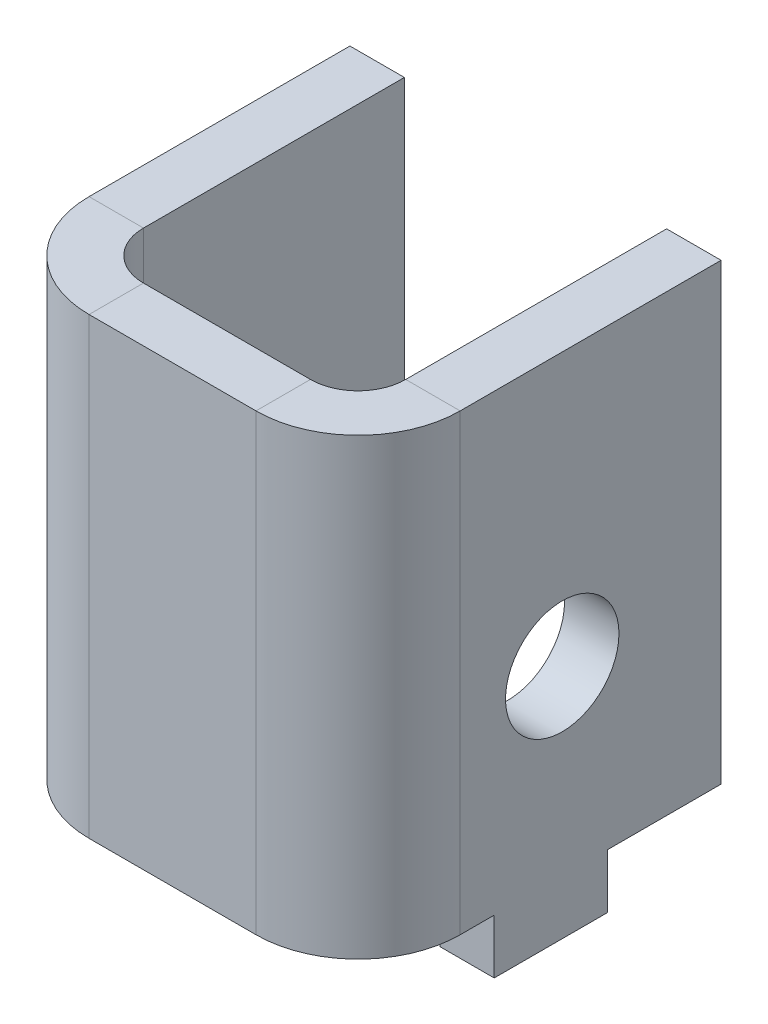
ISO-10303-21;
HEADER;
FILE_DESCRIPTION(('STEP AP214'),'2;1');
FILE_NAME('part.step','',(''),(''),'','','');
FILE_SCHEMA(('AUTOMOTIVE_DESIGN { 1 0 10303 214 1 1 1 1 }'));
ENDSEC;
DATA;
#1=APPLICATION_CONTEXT('core data for automotive mechanical design processes');
#2=APPLICATION_PROTOCOL_DEFINITION('international standard','automotive_design',2000,#1);
#3=PRODUCT_CONTEXT('',#1,'mechanical');
#4=PRODUCT('Part','Part','',(#3));
#5=PRODUCT_RELATED_PRODUCT_CATEGORY('part','',(#4));
#6=PRODUCT_DEFINITION_FORMATION('','',#4);
#7=PRODUCT_DEFINITION_CONTEXT('part definition',#1,'design');
#8=PRODUCT_DEFINITION('design','',#6,#7);
#9=PRODUCT_DEFINITION_SHAPE('','',#8);
#10=(LENGTH_UNIT() NAMED_UNIT(*) SI_UNIT(.MILLI.,.METRE.));
#11=(NAMED_UNIT(*) PLANE_ANGLE_UNIT() SI_UNIT($,.RADIAN.));
#12=(NAMED_UNIT(*) SI_UNIT($,.STERADIAN.) SOLID_ANGLE_UNIT());
#13=UNCERTAINTY_MEASURE_WITH_UNIT(LENGTH_MEASURE(1.E-05),#10,'distance_accuracy_value','');
#14=(GEOMETRIC_REPRESENTATION_CONTEXT(3) GLOBAL_UNCERTAINTY_ASSIGNED_CONTEXT((#13)) GLOBAL_UNIT_ASSIGNED_CONTEXT((#10,
#11,#12)) REPRESENTATION_CONTEXT('',''));
#15=CARTESIAN_POINT('',(0.,0.,0.));
#16=DIRECTION('',(0.,0.,1.));
#17=DIRECTION('',(1.,0.,0.));
#18=AXIS2_PLACEMENT_3D('',#15,#16,#17);
#19=CARTESIAN_POINT('',(447.586099999998,811.2125,14.6050000000001));
#20=DIRECTION('',(0.,-1.,0.));
#21=DIRECTION('',(0.,0.,-1.));
#22=AXIS2_PLACEMENT_3D('',#19,#20,#21);
#23=PLANE('',#22);
#24=DIRECTION('',(0.,0.,1.));
#25=VECTOR('',#24,1.);
#26=CARTESIAN_POINT('',(432.523899999999,811.2125,1.11022302462516E-13));
#27=LINE('',#26,#25);
#28=CARTESIAN_POINT('',(432.523899999999,811.2125,12.7000000000001));
#29=VERTEX_POINT('',#28);
#30=CARTESIAN_POINT('',(432.523899999999,811.2125,14.6050000000001));
#31=VERTEX_POINT('',#30);
#32=EDGE_CURVE('E59',#29,#31,#27,.T.);
#33=ORIENTED_EDGE('',*,*,#32,.F.);
#34=DIRECTION('',(-1.,0.,0.));
#35=VECTOR('',#34,1.);
#36=CARTESIAN_POINT('',(435.571899999999,811.2125,12.7000000000001));
#37=LINE('',#36,#35);
#38=CARTESIAN_POINT('',(435.571899999999,811.2125,12.7000000000001));
#39=VERTEX_POINT('',#38);
#40=EDGE_CURVE('E197',#39,#29,#37,.T.);
#41=ORIENTED_EDGE('',*,*,#40,.F.);
#42=DIRECTION('',(0.,0.,1.));
#43=VECTOR('',#42,1.);
#44=CARTESIAN_POINT('',(435.571899999999,811.2125,1.11022302462516E-13));
#45=LINE('',#44,#43);
#46=CARTESIAN_POINT('',(435.571899999999,811.2125,14.6050000000001));
#47=VERTEX_POINT('',#46);
#48=EDGE_CURVE('E182',#39,#47,#45,.T.);
#49=ORIENTED_EDGE('',*,*,#48,.T.);
#50=DIRECTION('',(-1.,0.,0.));
#51=VECTOR('',#50,1.);
#52=CARTESIAN_POINT('',(435.571899999999,811.2125,14.6050000000001));
#53=LINE('',#52,#51);
#54=EDGE_CURVE('E52',#47,#31,#53,.T.);
#55=ORIENTED_EDGE('',*,*,#54,.T.);
#56=EDGE_LOOP('',(#33,#41,#49,#55));
#57=FACE_BOUND('',#56,.T.);
#58=ADVANCED_FACE('F43',(#57),#23,.T.);
#59=CARTESIAN_POINT('',(435.571899999999,811.2125,1.11022302462516E-13));
#60=VERTEX_POINT('',#59);
#61=CARTESIAN_POINT('',(435.571899999999,811.2125,6.35000000000011));
#62=VERTEX_POINT('',#61);
#63=EDGE_CURVE('E193',#60,#62,#45,.T.);
#64=ORIENTED_EDGE('',*,*,#63,.T.);
#65=DIRECTION('',(1.,0.,0.));
#66=VECTOR('',#65,1.);
#67=CARTESIAN_POINT('',(435.571899999999,811.2125,6.35000000000011));
#68=LINE('',#67,#66);
#69=CARTESIAN_POINT('',(432.523899999999,811.2125,6.35000000000011));
#70=VERTEX_POINT('',#69);
#71=EDGE_CURVE('E67',#70,#62,#68,.T.);
#72=ORIENTED_EDGE('',*,*,#71,.F.);
#73=CARTESIAN_POINT('',(432.523899999999,811.2125,1.11022302462516E-13));
#74=VERTEX_POINT('',#73);
#75=EDGE_CURVE('E272',#74,#70,#27,.T.);
#76=ORIENTED_EDGE('',*,*,#75,.F.);
#77=DIRECTION('',(-1.,0.,0.));
#78=VECTOR('',#77,1.);
#79=CARTESIAN_POINT('',(435.571899999999,811.2125,1.11022302462516E-13));
#80=LINE('',#79,#78);
#81=EDGE_CURVE('E194',#60,#74,#80,.T.);
#82=ORIENTED_EDGE('',*,*,#81,.F.);
#83=EDGE_LOOP('',(#64,#72,#76,#82));
#84=FACE_BOUND('',#83,.T.);
#85=ADVANCED_FACE('F453',(#84),#23,.T.);
#86=CARTESIAN_POINT('',(447.586099999998,811.2125,17.2720000000001));
#87=DIRECTION('',(0.,-1.,0.));
#88=DIRECTION('',(0.,0.,-1.));
#89=AXIS2_PLACEMENT_3D('',#86,#87,#88);
#90=PLANE('',#89);
#91=DIRECTION('',(0.,0.,-1.));
#92=VECTOR('',#91,1.);
#93=CARTESIAN_POINT('',(453.301099999998,811.2125,20.3200000000001));
#94=LINE('',#93,#92);
#95=CARTESIAN_POINT('',(453.301099999998,811.2125,6.35000000000011));
#96=VERTEX_POINT('',#95);
#97=CARTESIAN_POINT('',(453.301099999998,811.2125,1.11022302462516E-13));
#98=VERTEX_POINT('',#97);
#99=EDGE_CURVE('E259',#96,#98,#94,.T.);
#100=ORIENTED_EDGE('',*,*,#99,.F.);
#101=DIRECTION('',(1.,0.,0.));
#102=VECTOR('',#101,1.);
#103=CARTESIAN_POINT('',(450.253099999998,811.2125,6.35000000000011));
#104=LINE('',#103,#102);
#105=CARTESIAN_POINT('',(450.253099999998,811.2125,6.35000000000011));
#106=VERTEX_POINT('',#105);
#107=EDGE_CURVE('E200',#106,#96,#104,.T.);
#108=ORIENTED_EDGE('',*,*,#107,.F.);
#109=DIRECTION('',(0.,0.,-1.));
#110=VECTOR('',#109,1.);
#111=CARTESIAN_POINT('',(450.253099999998,811.2125,20.3200000000001));
#112=LINE('',#111,#110);
#113=CARTESIAN_POINT('',(450.253099999998,811.2125,1.11022302462516E-13));
#114=VERTEX_POINT('',#113);
#115=EDGE_CURVE('E256',#106,#114,#112,.T.);
#116=ORIENTED_EDGE('',*,*,#115,.T.);
#117=DIRECTION('',(-1.,0.,0.));
#118=VECTOR('',#117,1.);
#119=CARTESIAN_POINT('',(453.301099999998,811.2125,1.11022302462516E-13));
#120=LINE('',#119,#118);
#121=EDGE_CURVE('E255',#98,#114,#120,.T.);
#122=ORIENTED_EDGE('',*,*,#121,.F.);
#123=EDGE_LOOP('',(#100,#108,#116,#122));
#124=FACE_BOUND('',#123,.T.);
#125=ADVANCED_FACE('F418',(#124),#90,.T.);
#126=CARTESIAN_POINT('',(450.253099999998,811.2125,14.6050000000001));
#127=VERTEX_POINT('',#126);
#128=CARTESIAN_POINT('',(450.253099999998,811.2125,12.7000000000001));
#129=VERTEX_POINT('',#128);
#130=EDGE_CURVE('E252',#127,#129,#112,.T.);
#131=ORIENTED_EDGE('',*,*,#130,.T.);
#132=DIRECTION('',(-1.,0.,0.));
#133=VECTOR('',#132,1.);
#134=CARTESIAN_POINT('',(450.253099999998,811.2125,12.7000000000001));
#135=LINE('',#134,#133);
#136=CARTESIAN_POINT('',(453.301099999998,811.2125,12.7000000000001));
#137=VERTEX_POINT('',#136);
#138=EDGE_CURVE('E224',#137,#129,#135,.T.);
#139=ORIENTED_EDGE('',*,*,#138,.F.);
#140=CARTESIAN_POINT('',(453.301099999998,811.2125,14.6050000000001));
#141=VERTEX_POINT('',#140);
#142=EDGE_CURVE('E260',#141,#137,#94,.T.);
#143=ORIENTED_EDGE('',*,*,#142,.F.);
#144=DIRECTION('',(-1.,0.,0.));
#145=VECTOR('',#144,1.);
#146=CARTESIAN_POINT('',(453.301099999998,811.2125,14.6050000000001));
#147=LINE('',#146,#145);
#148=EDGE_CURVE('E355',#141,#127,#147,.T.);
#149=ORIENTED_EDGE('',*,*,#148,.T.);
#150=EDGE_LOOP('',(#131,#139,#143,#149));
#151=FACE_BOUND('',#150,.T.);
#152=ADVANCED_FACE('F396',(#151),#90,.T.);
#153=CARTESIAN_POINT('',(438.238899999999,811.2125,20.3200000000001));
#154=DIRECTION('',(0.,-1.,0.));
#155=DIRECTION('',(0.,0.,-1.));
#156=AXIS2_PLACEMENT_3D('',#153,#154,#155);
#157=PLANE('',#156);
#158=DIRECTION('',(0.,0.,-1.));
#159=VECTOR('',#158,1.);
#160=CARTESIAN_POINT('',(438.238899999999,811.2125,20.3200000000001));
#161=LINE('',#160,#159);
#162=CARTESIAN_POINT('',(438.238899999999,811.2125,20.3200000000001));
#163=VERTEX_POINT('',#162);
#164=CARTESIAN_POINT('',(438.238899999999,811.2125,17.2720000000001));
#165=VERTEX_POINT('',#164);
#166=EDGE_CURVE('E11',#163,#165,#161,.T.);
#167=ORIENTED_EDGE('',*,*,#166,.F.);
#168=CARTESIAN_POINT('',(438.238899999999,811.2125,14.6050000000001));
#169=DIRECTION('',(0.,-1.,0.));
#170=DIRECTION('',(0.,0.,-1.));
#171=AXIS2_PLACEMENT_3D('',#168,#169,#170);
#172=CIRCLE('',#171,5.715);
#173=EDGE_CURVE('E269',#31,#163,#172,.F.);
#174=ORIENTED_EDGE('',*,*,#173,.F.);
#175=ORIENTED_EDGE('',*,*,#54,.F.);
#176=CARTESIAN_POINT('',(438.238899999999,811.2125,14.6050000000001));
#177=DIRECTION('',(0.,-1.,0.));
#178=DIRECTION('',(1.,0.,0.));
#179=AXIS2_PLACEMENT_3D('',#176,#177,#178);
#180=CIRCLE('',#179,2.667);
#181=EDGE_CURVE('E276',#47,#165,#180,.F.);
#182=ORIENTED_EDGE('',*,*,#181,.T.);
#183=EDGE_LOOP('',(#167,#174,#175,#182));
#184=FACE_BOUND('',#183,.T.);
#185=ADVANCED_FACE('F45',(#184),#157,.T.);
#186=CARTESIAN_POINT('',(435.571899999999,811.2125,14.6050000000001));
#187=DIRECTION('',(0.,-1.,0.));
#188=DIRECTION('',(0.,0.,-1.));
#189=AXIS2_PLACEMENT_3D('',#186,#187,#188);
#190=PLANE('',#189);
#191=DIRECTION('',(1.,0.,0.));
#192=VECTOR('',#191,1.);
#193=CARTESIAN_POINT('',(432.523899999999,811.2125,20.3200000000001));
#194=LINE('',#193,#192);
#195=CARTESIAN_POINT('',(447.586099999998,811.2125,20.3200000000001));
#196=VERTEX_POINT('',#195);
#197=EDGE_CURVE('E266',#163,#196,#194,.T.);
#198=ORIENTED_EDGE('',*,*,#197,.F.);
#199=ORIENTED_EDGE('',*,*,#166,.T.);
#200=DIRECTION('',(1.,0.,0.));
#201=VECTOR('',#200,1.);
#202=CARTESIAN_POINT('',(432.523899999999,811.2125,17.2720000000001));
#203=LINE('',#202,#201);
#204=CARTESIAN_POINT('',(447.586099999998,811.2125,17.2720000000001));
#205=VERTEX_POINT('',#204);
#206=EDGE_CURVE('E279',#165,#205,#203,.T.);
#207=ORIENTED_EDGE('',*,*,#206,.T.);
#208=DIRECTION('',(0.,0.,1.));
#209=VECTOR('',#208,1.);
#210=CARTESIAN_POINT('',(447.586099999998,811.2125,17.2720000000001));
#211=LINE('',#210,#209);
#212=EDGE_CURVE('E353',#205,#196,#211,.T.);
#213=ORIENTED_EDGE('',*,*,#212,.T.);
#214=EDGE_LOOP('',(#198,#199,#207,#213));
#215=FACE_BOUND('',#214,.T.);
#216=ADVANCED_FACE('F376',(#215),#190,.T.);
#217=CARTESIAN_POINT('',(432.523899999999,836.6125,14.6050000000001));
#218=DIRECTION('',(0.,1.,0.));
#219=DIRECTION('',(0.,0.,1.));
#220=AXIS2_PLACEMENT_3D('',#217,#218,#219);
#221=PLANE('',#220);
#222=DIRECTION('',(1.,0.,0.));
#223=VECTOR('',#222,1.);
#224=CARTESIAN_POINT('',(432.523899999999,836.6125,14.6050000000001));
#225=LINE('',#224,#223);
#226=CARTESIAN_POINT('',(432.523899999999,836.6125,14.6050000000001));
#227=VERTEX_POINT('',#226);
#228=CARTESIAN_POINT('',(435.571899999999,836.6125,14.6050000000001));
#229=VERTEX_POINT('',#228);
#230=EDGE_CURVE('E359',#227,#229,#225,.T.);
#231=ORIENTED_EDGE('',*,*,#230,.F.);
#232=CARTESIAN_POINT('',(438.238899999999,836.6125,14.6050000000001));
#233=DIRECTION('',(0.,-1.,0.));
#234=DIRECTION('',(0.,0.,-1.));
#235=AXIS2_PLACEMENT_3D('',#232,#233,#234);
#236=CIRCLE('',#235,5.715);
#237=CARTESIAN_POINT('',(438.238899999999,836.6125,20.3200000000001));
#238=VERTEX_POINT('',#237);
#239=EDGE_CURVE('E300',#227,#238,#236,.F.);
#240=ORIENTED_EDGE('',*,*,#239,.T.);
#241=DIRECTION('',(0.,0.,1.));
#242=VECTOR('',#241,1.);
#243=CARTESIAN_POINT('',(438.238899999999,836.6125,17.2720000000001));
#244=LINE('',#243,#242);
#245=CARTESIAN_POINT('',(438.238899999999,836.6125,17.2720000000001));
#246=VERTEX_POINT('',#245);
#247=EDGE_CURVE('E357',#246,#238,#244,.T.);
#248=ORIENTED_EDGE('',*,*,#247,.F.);
#249=CARTESIAN_POINT('',(438.238899999999,836.6125,14.6050000000001));
#250=DIRECTION('',(0.,-1.,0.));
#251=DIRECTION('',(1.,0.,0.));
#252=AXIS2_PLACEMENT_3D('',#249,#250,#251);
#253=CIRCLE('',#252,2.667);
#254=EDGE_CURVE('E311',#229,#246,#253,.F.);
#255=ORIENTED_EDGE('',*,*,#254,.F.);
#256=EDGE_LOOP('',(#231,#240,#248,#255));
#257=FACE_BOUND('',#256,.T.);
#258=ADVANCED_FACE('F438',(#257),#221,.T.);
#259=CARTESIAN_POINT('',(438.238899999999,836.6125,17.2720000000001));
#260=DIRECTION('',(0.,1.,0.));
#261=DIRECTION('',(0.,0.,1.));
#262=AXIS2_PLACEMENT_3D('',#259,#260,#261);
#263=PLANE('',#262);
#264=DIRECTION('',(0.,0.,1.));
#265=VECTOR('',#264,1.);
#266=CARTESIAN_POINT('',(432.523899999999,836.6125,1.11022302462516E-13));
#267=LINE('',#266,#265);
#268=CARTESIAN_POINT('',(432.523899999999,836.6125,1.11022302462516E-13));
#269=VERTEX_POINT('',#268);
#270=EDGE_CURVE('E303',#269,#227,#267,.T.);
#271=ORIENTED_EDGE('',*,*,#270,.T.);
#272=ORIENTED_EDGE('',*,*,#230,.T.);
#273=DIRECTION('',(0.,0.,1.));
#274=VECTOR('',#273,1.);
#275=CARTESIAN_POINT('',(435.571899999999,836.6125,1.11022302462516E-13));
#276=LINE('',#275,#274);
#277=CARTESIAN_POINT('',(435.571899999999,836.6125,1.11022302462516E-13));
#278=VERTEX_POINT('',#277);
#279=EDGE_CURVE('E309',#278,#229,#276,.T.);
#280=ORIENTED_EDGE('',*,*,#279,.F.);
#281=DIRECTION('',(-1.,0.,0.));
#282=VECTOR('',#281,1.);
#283=CARTESIAN_POINT('',(435.571899999999,836.6125,1.11022302462516E-13));
#284=LINE('',#283,#282);
#285=EDGE_CURVE('E306',#278,#269,#284,.T.);
#286=ORIENTED_EDGE('',*,*,#285,.T.);
#287=EDGE_LOOP('',(#271,#272,#280,#286));
#288=FACE_BOUND('',#287,.T.);
#289=ADVANCED_FACE('F630',(#288),#263,.T.);
#290=CARTESIAN_POINT('',(453.301099999998,811.2125,14.6050000000001));
#291=DIRECTION('',(0.,-1.,0.));
#292=DIRECTION('',(0.,0.,-1.));
#293=AXIS2_PLACEMENT_3D('',#290,#291,#292);
#294=PLANE('',#293);
#295=ORIENTED_EDGE('',*,*,#148,.F.);
#296=CARTESIAN_POINT('',(447.586099999998,811.2125,14.6050000000001));
#297=DIRECTION('',(0.,-1.,0.));
#298=DIRECTION('',(0.,0.,-1.));
#299=AXIS2_PLACEMENT_3D('',#296,#297,#298);
#300=CIRCLE('',#299,5.715);
#301=EDGE_CURVE('E263',#196,#141,#300,.F.);
#302=ORIENTED_EDGE('',*,*,#301,.F.);
#303=ORIENTED_EDGE('',*,*,#212,.F.);
#304=CARTESIAN_POINT('',(447.586099999998,811.2125,14.6050000000001));
#305=DIRECTION('',(0.,-1.,0.));
#306=DIRECTION('',(1.,0.,0.));
#307=AXIS2_PLACEMENT_3D('',#304,#305,#306);
#308=CIRCLE('',#307,2.667);
#309=EDGE_CURVE('E282',#205,#127,#308,.F.);
#310=ORIENTED_EDGE('',*,*,#309,.T.);
#311=EDGE_LOOP('',(#295,#302,#303,#310));
#312=FACE_BOUND('',#311,.T.);
#313=ADVANCED_FACE('F385',(#312),#294,.T.);
#314=CARTESIAN_POINT('',(447.586099999998,836.6125,20.3200000000001));
#315=DIRECTION('',(0.,1.,0.));
#316=DIRECTION('',(0.,0.,1.));
#317=AXIS2_PLACEMENT_3D('',#314,#315,#316);
#318=PLANE('',#317);
#319=DIRECTION('',(0.,0.,-1.));
#320=VECTOR('',#319,1.);
#321=CARTESIAN_POINT('',(447.586099999998,836.6125,20.3200000000001));
#322=LINE('',#321,#320);
#323=CARTESIAN_POINT('',(447.586099999998,836.6125,20.3200000000001));
#324=VERTEX_POINT('',#323);
#325=CARTESIAN_POINT('',(447.586099999998,836.6125,17.2720000000001));
#326=VERTEX_POINT('',#325);
#327=EDGE_CURVE('E351',#324,#326,#322,.T.);
#328=ORIENTED_EDGE('',*,*,#327,.F.);
#329=CARTESIAN_POINT('',(447.586099999998,836.6125,14.6050000000001));
#330=DIRECTION('',(0.,-1.,0.));
#331=DIRECTION('',(0.,0.,-1.));
#332=AXIS2_PLACEMENT_3D('',#329,#330,#331);
#333=CIRCLE('',#332,5.715);
#334=CARTESIAN_POINT('',(453.301099999998,836.6125,14.6050000000001));
#335=VERTEX_POINT('',#334);
#336=EDGE_CURVE('E294',#324,#335,#333,.F.);
#337=ORIENTED_EDGE('',*,*,#336,.T.);
#338=DIRECTION('',(1.,0.,0.));
#339=VECTOR('',#338,1.);
#340=CARTESIAN_POINT('',(450.253099999998,836.6125,14.6050000000001));
#341=LINE('',#340,#339);
#342=CARTESIAN_POINT('',(450.253099999998,836.6125,14.6050000000001));
#343=VERTEX_POINT('',#342);
#344=EDGE_CURVE('E349',#343,#335,#341,.T.);
#345=ORIENTED_EDGE('',*,*,#344,.F.);
#346=CARTESIAN_POINT('',(447.586099999998,836.6125,14.6050000000001));
#347=DIRECTION('',(0.,-1.,0.));
#348=DIRECTION('',(1.,0.,0.));
#349=AXIS2_PLACEMENT_3D('',#346,#347,#348);
#350=CIRCLE('',#349,2.667);
#351=EDGE_CURVE('E317',#326,#343,#350,.F.);
#352=ORIENTED_EDGE('',*,*,#351,.F.);
#353=EDGE_LOOP('',(#328,#337,#345,#352));
#354=FACE_BOUND('',#353,.T.);
#355=ADVANCED_FACE('F428',(#354),#318,.T.);
#356=CARTESIAN_POINT('',(450.253099999998,836.6125,14.6050000000001));
#357=DIRECTION('',(0.,1.,0.));
#358=DIRECTION('',(0.,0.,1.));
#359=AXIS2_PLACEMENT_3D('',#356,#357,#358);
#360=PLANE('',#359);
#361=DIRECTION('',(1.,0.,0.));
#362=VECTOR('',#361,1.);
#363=CARTESIAN_POINT('',(432.523899999999,836.6125,20.3200000000001));
#364=LINE('',#363,#362);
#365=EDGE_CURVE('E297',#238,#324,#364,.T.);
#366=ORIENTED_EDGE('',*,*,#365,.T.);
#367=ORIENTED_EDGE('',*,*,#327,.T.);
#368=DIRECTION('',(1.,0.,0.));
#369=VECTOR('',#368,1.);
#370=CARTESIAN_POINT('',(432.523899999999,836.6125,17.2720000000001));
#371=LINE('',#370,#369);
#372=EDGE_CURVE('E314',#246,#326,#371,.T.);
#373=ORIENTED_EDGE('',*,*,#372,.F.);
#374=ORIENTED_EDGE('',*,*,#247,.T.);
#375=EDGE_LOOP('',(#366,#367,#373,#374));
#376=FACE_BOUND('',#375,.T.);
#377=ADVANCED_FACE('F435',(#376),#360,.T.);
#378=CARTESIAN_POINT('',(450.253099999998,811.2125,20.3200000000001));
#379=DIRECTION('',(1.,0.,0.));
#380=DIRECTION('',(0.,1.,0.));
#381=AXIS2_PLACEMENT_3D('',#378,#379,#380);
#382=PLANE('',#381);
#383=CARTESIAN_POINT('',(450.253099999998,821.3725,8.89000000000131));
#384=DIRECTION('',(1.,0.,0.));
#385=DIRECTION('',(0.,1.,0.));
#386=AXIS2_PLACEMENT_3D('',#383,#384,#385);
#387=CIRCLE('',#386,3.175);
#388=CARTESIAN_POINT('',(450.253099999998,824.5475,8.89000000000131));
#389=VERTEX_POINT('',#388);
#390=EDGE_CURVE('E248',#389,#389,#387,.T.);
#391=ORIENTED_EDGE('',*,*,#390,.T.);
#392=EDGE_LOOP('',(#391));
#393=FACE_BOUND('',#392,.T.);
#394=DIRECTION('',(0.,0.,-1.));
#395=VECTOR('',#394,1.);
#396=CARTESIAN_POINT('',(450.253099999998,836.6125,20.3200000000001));
#397=LINE('',#396,#395);
#398=CARTESIAN_POINT('',(450.253099999998,836.6125,1.11022302462516E-13));
#399=VERTEX_POINT('',#398);
#400=EDGE_CURVE('E251',#343,#399,#397,.T.);
#401=ORIENTED_EDGE('',*,*,#400,.T.);
#402=DIRECTION('',(0.,1.,0.));
#403=VECTOR('',#402,1.);
#404=CARTESIAN_POINT('',(450.253099999998,811.2125,1.11022302462516E-13));
#405=LINE('',#404,#403);
#406=EDGE_CURVE('E347',#114,#399,#405,.T.);
#407=ORIENTED_EDGE('',*,*,#406,.F.);
#408=ORIENTED_EDGE('',*,*,#115,.F.);
#409=DIRECTION('',(0.,1.,0.));
#410=VECTOR('',#409,1.);
#411=CARTESIAN_POINT('',(450.253099999998,808.1645,6.35000000000011));
#412=LINE('',#411,#410);
#413=CARTESIAN_POINT('',(450.253099999998,808.1645,6.35000000000011));
#414=VERTEX_POINT('',#413);
#415=EDGE_CURVE('E240',#414,#106,#412,.T.);
#416=ORIENTED_EDGE('',*,*,#415,.F.);
#417=DIRECTION('',(0.,0.,-1.));
#418=VECTOR('',#417,1.);
#419=CARTESIAN_POINT('',(450.253099999998,808.1645,12.7000000000001));
#420=LINE('',#419,#418);
#421=CARTESIAN_POINT('',(450.253099999998,808.1645,12.7000000000001));
#422=VERTEX_POINT('',#421);
#423=EDGE_CURVE('E220',#422,#414,#420,.T.);
#424=ORIENTED_EDGE('',*,*,#423,.F.);
#425=DIRECTION('',(0.,1.,0.));
#426=VECTOR('',#425,1.);
#427=CARTESIAN_POINT('',(450.253099999998,808.1645,12.7000000000001));
#428=LINE('',#427,#426);
#429=EDGE_CURVE('E230',#422,#129,#428,.T.);
#430=ORIENTED_EDGE('',*,*,#429,.T.);
#431=ORIENTED_EDGE('',*,*,#130,.F.);
#432=DIRECTION('',(0.,1.,0.));
#433=VECTOR('',#432,1.);
#434=CARTESIAN_POINT('',(450.253099999998,811.2125,14.6050000000001));
#435=LINE('',#434,#433);
#436=EDGE_CURVE('E285',#127,#343,#435,.T.);
#437=ORIENTED_EDGE('',*,*,#436,.T.);
#438=EDGE_LOOP('',(#401,#407,#408,#416,#424,#430,#431,#437));
#439=FACE_BOUND('',#438,.T.);
#440=ADVANCED_FACE('F404',(#393,#439),#382,.F.);
#441=CARTESIAN_POINT('',(453.301099999998,811.2125,1.11022302462516E-13));
#442=DIRECTION('',(0.,0.,-1.));
#443=DIRECTION('',(0.,1.,0.));
#444=AXIS2_PLACEMENT_3D('',#441,#442,#443);
#445=PLANE('',#444);
#446=DIRECTION('',(-1.,0.,0.));
#447=VECTOR('',#446,1.);
#448=CARTESIAN_POINT('',(453.301099999998,836.6125,1.11022302462516E-13));
#449=LINE('',#448,#447);
#450=CARTESIAN_POINT('',(453.301099999998,836.6125,1.11022302462516E-13));
#451=VERTEX_POINT('',#450);
#452=EDGE_CURVE('E288',#451,#399,#449,.T.);
#453=ORIENTED_EDGE('',*,*,#452,.F.);
#454=DIRECTION('',(0.,1.,0.));
#455=VECTOR('',#454,1.);
#456=CARTESIAN_POINT('',(453.301099999998,811.2125,1.11022302462516E-13));
#457=LINE('',#456,#455);
#458=EDGE_CURVE('E345',#98,#451,#457,.T.);
#459=ORIENTED_EDGE('',*,*,#458,.F.);
#460=ORIENTED_EDGE('',*,*,#121,.T.);
#461=ORIENTED_EDGE('',*,*,#406,.T.);
#462=EDGE_LOOP('',(#453,#459,#460,#461));
#463=FACE_BOUND('',#462,.T.);
#464=ADVANCED_FACE('F422',(#463),#445,.T.);
#465=CARTESIAN_POINT('',(453.301099999998,811.2125,20.3200000000001));
#466=DIRECTION('',(1.,0.,0.));
#467=DIRECTION('',(0.,1.,0.));
#468=AXIS2_PLACEMENT_3D('',#465,#466,#467);
#469=PLANE('',#468);
#470=CARTESIAN_POINT('',(453.301099999998,821.3725,8.89000000000135));
#471=DIRECTION('',(1.,0.,0.));
#472=DIRECTION('',(0.,0.,-1.));
#473=AXIS2_PLACEMENT_3D('',#470,#471,#472);
#474=CIRCLE('',#473,3.175);
#475=CARTESIAN_POINT('',(453.301099999998,821.3725,5.71500000000135));
#476=VERTEX_POINT('',#475);
#477=EDGE_CURVE('E242',#476,#476,#474,.T.);
#478=ORIENTED_EDGE('',*,*,#477,.F.);
#479=EDGE_LOOP('',(#478));
#480=FACE_BOUND('',#479,.T.);
#481=DIRECTION('',(0.,0.,-1.));
#482=VECTOR('',#481,1.);
#483=CARTESIAN_POINT('',(453.301099999998,836.6125,20.3200000000001));
#484=LINE('',#483,#482);
#485=EDGE_CURVE('E291',#335,#451,#484,.T.);
#486=ORIENTED_EDGE('',*,*,#485,.F.);
#487=DIRECTION('',(0.,1.,0.));
#488=VECTOR('',#487,1.);
#489=CARTESIAN_POINT('',(453.301099999998,811.2125,14.6050000000001));
#490=LINE('',#489,#488);
#491=EDGE_CURVE('E342',#141,#335,#490,.T.);
#492=ORIENTED_EDGE('',*,*,#491,.F.);
#493=ORIENTED_EDGE('',*,*,#142,.T.);
#494=DIRECTION('',(0.,1.,0.));
#495=VECTOR('',#494,1.);
#496=CARTESIAN_POINT('',(453.301099999998,808.1645,12.7000000000001));
#497=LINE('',#496,#495);
#498=CARTESIAN_POINT('',(453.301099999998,808.1645,12.7000000000001));
#499=VERTEX_POINT('',#498);
#500=EDGE_CURVE('E236',#499,#137,#497,.T.);
#501=ORIENTED_EDGE('',*,*,#500,.F.);
#502=DIRECTION('',(0.,0.,1.));
#503=VECTOR('',#502,1.);
#504=CARTESIAN_POINT('',(453.301099999998,808.1645,12.7000000000001));
#505=LINE('',#504,#503);
#506=CARTESIAN_POINT('',(453.301099999998,808.1645,6.35000000000011));
#507=VERTEX_POINT('',#506);
#508=EDGE_CURVE('E226',#507,#499,#505,.T.);
#509=ORIENTED_EDGE('',*,*,#508,.F.);
#510=DIRECTION('',(0.,1.,0.));
#511=VECTOR('',#510,1.);
#512=CARTESIAN_POINT('',(453.301099999998,808.1645,6.35000000000011));
#513=LINE('',#512,#511);
#514=EDGE_CURVE('E238',#507,#96,#513,.T.);
#515=ORIENTED_EDGE('',*,*,#514,.T.);
#516=ORIENTED_EDGE('',*,*,#99,.T.);
#517=ORIENTED_EDGE('',*,*,#458,.T.);
#518=EDGE_LOOP('',(#486,#492,#493,#501,#509,#515,#516,#517));
#519=FACE_BOUND('',#518,.T.);
#520=ADVANCED_FACE('F393',(#480,#519),#469,.T.);
#521=CARTESIAN_POINT('',(447.586099999998,811.2125,14.6050000000001));
#522=DIRECTION('',(0.,1.,0.));
#523=DIRECTION('',(0.,0.,1.));
#524=AXIS2_PLACEMENT_3D('',#521,#522,#523);
#525=CYLINDRICAL_SURFACE('',#524,5.715);
#526=ORIENTED_EDGE('',*,*,#336,.F.);
#527=DIRECTION('',(0.,1.,0.));
#528=VECTOR('',#527,1.);
#529=CARTESIAN_POINT('',(447.586099999998,811.2125,20.3200000000001));
#530=LINE('',#529,#528);
#531=EDGE_CURVE('E339',#196,#324,#530,.T.);
#532=ORIENTED_EDGE('',*,*,#531,.F.);
#533=ORIENTED_EDGE('',*,*,#301,.T.);
#534=ORIENTED_EDGE('',*,*,#491,.T.);
#535=EDGE_LOOP('',(#526,#532,#533,#534));
#536=FACE_BOUND('',#535,.T.);
#537=ADVANCED_FACE('F384',(#536),#525,.T.);
#538=CARTESIAN_POINT('',(432.523899999999,811.2125,20.3200000000001));
#539=DIRECTION('',(0.,0.,1.));
#540=DIRECTION('',(0.,-1.,0.));
#541=AXIS2_PLACEMENT_3D('',#538,#539,#540);
#542=PLANE('',#541);
#543=ORIENTED_EDGE('',*,*,#365,.F.);
#544=DIRECTION('',(0.,1.,0.));
#545=VECTOR('',#544,1.);
#546=CARTESIAN_POINT('',(438.238899999999,811.2125,20.3200000000001));
#547=LINE('',#546,#545);
#548=EDGE_CURVE('E336',#163,#238,#547,.T.);
#549=ORIENTED_EDGE('',*,*,#548,.F.);
#550=ORIENTED_EDGE('',*,*,#197,.T.);
#551=ORIENTED_EDGE('',*,*,#531,.T.);
#552=EDGE_LOOP('',(#543,#549,#550,#551));
#553=FACE_BOUND('',#552,.T.);
#554=ADVANCED_FACE('F375',(#553),#542,.T.);
#555=CARTESIAN_POINT('',(438.238899999999,811.2125,14.6050000000001));
#556=DIRECTION('',(0.,1.,0.));
#557=DIRECTION('',(0.,0.,1.));
#558=AXIS2_PLACEMENT_3D('',#555,#556,#557);
#559=CYLINDRICAL_SURFACE('',#558,5.715);
#560=ORIENTED_EDGE('',*,*,#239,.F.);
#561=DIRECTION('',(0.,1.,0.));
#562=VECTOR('',#561,1.);
#563=CARTESIAN_POINT('',(432.523899999999,811.2125,14.6050000000001));
#564=LINE('',#563,#562);
#565=EDGE_CURVE('E333',#31,#227,#564,.T.);
#566=ORIENTED_EDGE('',*,*,#565,.F.);
#567=ORIENTED_EDGE('',*,*,#173,.T.);
#568=ORIENTED_EDGE('',*,*,#548,.T.);
#569=EDGE_LOOP('',(#560,#566,#567,#568));
#570=FACE_BOUND('',#569,.T.);
#571=ADVANCED_FACE('F366',(#570),#559,.T.);
#572=CARTESIAN_POINT('',(432.523899999999,811.2125,1.11022302462516E-13));
#573=DIRECTION('',(-1.,0.,0.));
#574=DIRECTION('',(0.,-1.,0.));
#575=AXIS2_PLACEMENT_3D('',#572,#573,#574);
#576=PLANE('',#575);
#577=CARTESIAN_POINT('',(432.523899999999,821.3725,8.89000000000106));
#578=DIRECTION('',(1.,0.,0.));
#579=DIRECTION('',(0.,0.,-1.));
#580=AXIS2_PLACEMENT_3D('',#577,#578,#579);
#581=CIRCLE('',#580,3.175);
#582=CARTESIAN_POINT('',(432.523899999999,821.3725,5.71500000000106));
#583=VERTEX_POINT('',#582);
#584=EDGE_CURVE('E243',#583,#583,#581,.T.);
#585=ORIENTED_EDGE('',*,*,#584,.T.);
#586=EDGE_LOOP('',(#585));
#587=FACE_BOUND('',#586,.T.);
#588=ORIENTED_EDGE('',*,*,#270,.F.);
#589=DIRECTION('',(0.,1.,0.));
#590=VECTOR('',#589,1.);
#591=CARTESIAN_POINT('',(432.523899999999,811.2125,1.11022302462516E-13));
#592=LINE('',#591,#590);
#593=EDGE_CURVE('E331',#74,#269,#592,.T.);
#594=ORIENTED_EDGE('',*,*,#593,.F.);
#595=ORIENTED_EDGE('',*,*,#75,.T.);
#596=DIRECTION('',(0.,1.,0.));
#597=VECTOR('',#596,1.);
#598=CARTESIAN_POINT('',(432.523899999999,808.1645,6.35000000000011));
#599=LINE('',#598,#597);
#600=CARTESIAN_POINT('',(432.523899999999,808.1645,6.35000000000011));
#601=VERTEX_POINT('',#600);
#602=EDGE_CURVE('E211',#601,#70,#599,.T.);
#603=ORIENTED_EDGE('',*,*,#602,.F.);
#604=DIRECTION('',(0.,0.,-1.));
#605=VECTOR('',#604,1.);
#606=CARTESIAN_POINT('',(432.523899999999,808.1645,12.7000000000001));
#607=LINE('',#606,#605);
#608=CARTESIAN_POINT('',(432.523899999999,808.1645,12.7000000000001));
#609=VERTEX_POINT('',#608);
#610=EDGE_CURVE('E217',#609,#601,#607,.T.);
#611=ORIENTED_EDGE('',*,*,#610,.F.);
#612=DIRECTION('',(0.,1.,0.));
#613=VECTOR('',#612,1.);
#614=CARTESIAN_POINT('',(432.523899999999,808.1645,12.7000000000001));
#615=LINE('',#614,#613);
#616=EDGE_CURVE('E619',#609,#29,#615,.T.);
#617=ORIENTED_EDGE('',*,*,#616,.T.);
#618=ORIENTED_EDGE('',*,*,#32,.T.);
#619=ORIENTED_EDGE('',*,*,#565,.T.);
#620=EDGE_LOOP('',(#588,#594,#595,#603,#611,#617,#618,#619));
#621=FACE_BOUND('',#620,.T.);
#622=ADVANCED_FACE('F548',(#587,#621),#576,.T.);
#623=CARTESIAN_POINT('',(435.571899999999,811.2125,1.11022302462516E-13));
#624=DIRECTION('',(0.,0.,-1.));
#625=DIRECTION('',(0.,1.,0.));
#626=AXIS2_PLACEMENT_3D('',#623,#624,#625);
#627=PLANE('',#626);
#628=ORIENTED_EDGE('',*,*,#285,.F.);
#629=DIRECTION('',(0.,1.,0.));
#630=VECTOR('',#629,1.);
#631=CARTESIAN_POINT('',(435.571899999999,811.2125,1.11022302462516E-13));
#632=LINE('',#631,#630);
#633=EDGE_CURVE('E329',#60,#278,#632,.T.);
#634=ORIENTED_EDGE('',*,*,#633,.F.);
#635=ORIENTED_EDGE('',*,*,#81,.T.);
#636=ORIENTED_EDGE('',*,*,#593,.T.);
#637=EDGE_LOOP('',(#628,#634,#635,#636));
#638=FACE_BOUND('',#637,.T.);
#639=ADVANCED_FACE('F449',(#638),#627,.T.);
#640=CARTESIAN_POINT('',(435.571899999999,811.2125,1.11022302462516E-13));
#641=DIRECTION('',(-1.,0.,0.));
#642=DIRECTION('',(0.,-1.,0.));
#643=AXIS2_PLACEMENT_3D('',#640,#641,#642);
#644=PLANE('',#643);
#645=CARTESIAN_POINT('',(435.571899999999,821.3725,8.89000000000111));
#646=DIRECTION('',(-1.,0.,0.));
#647=DIRECTION('',(0.,-1.,0.));
#648=AXIS2_PLACEMENT_3D('',#645,#646,#647);
#649=CIRCLE('',#648,3.175);
#650=CARTESIAN_POINT('',(435.571899999999,818.1975,8.89000000000111));
#651=VERTEX_POINT('',#650);
#652=EDGE_CURVE('E47',#651,#651,#649,.T.);
#653=ORIENTED_EDGE('',*,*,#652,.T.);
#654=EDGE_LOOP('',(#653));
#655=FACE_BOUND('',#654,.T.);
#656=ORIENTED_EDGE('',*,*,#279,.T.);
#657=DIRECTION('',(0.,1.,0.));
#658=VECTOR('',#657,1.);
#659=CARTESIAN_POINT('',(435.571899999999,811.2125,14.6050000000001));
#660=LINE('',#659,#658);
#661=EDGE_CURVE('E190',#47,#229,#660,.T.);
#662=ORIENTED_EDGE('',*,*,#661,.F.);
#663=ORIENTED_EDGE('',*,*,#48,.F.);
#664=DIRECTION('',(0.,1.,0.));
#665=VECTOR('',#664,1.);
#666=CARTESIAN_POINT('',(435.571899999999,808.1645,12.7000000000001));
#667=LINE('',#666,#665);
#668=CARTESIAN_POINT('',(435.571899999999,808.1645,12.7000000000001));
#669=VERTEX_POINT('',#668);
#670=EDGE_CURVE('E187',#669,#39,#667,.T.);
#671=ORIENTED_EDGE('',*,*,#670,.F.);
#672=DIRECTION('',(0.,0.,1.));
#673=VECTOR('',#672,1.);
#674=CARTESIAN_POINT('',(435.571899999999,808.1645,12.7000000000001));
#675=LINE('',#674,#673);
#676=CARTESIAN_POINT('',(435.571899999999,808.1645,6.35000000000011));
#677=VERTEX_POINT('',#676);
#678=EDGE_CURVE('E205',#677,#669,#675,.T.);
#679=ORIENTED_EDGE('',*,*,#678,.F.);
#680=DIRECTION('',(0.,1.,0.));
#681=VECTOR('',#680,1.);
#682=CARTESIAN_POINT('',(435.571899999999,808.1645,6.35000000000011));
#683=LINE('',#682,#681);
#684=EDGE_CURVE('E206',#677,#62,#683,.T.);
#685=ORIENTED_EDGE('',*,*,#684,.T.);
#686=ORIENTED_EDGE('',*,*,#63,.F.);
#687=ORIENTED_EDGE('',*,*,#633,.T.);
#688=EDGE_LOOP('',(#656,#662,#663,#671,#679,#685,#686,#687));
#689=FACE_BOUND('',#688,.T.);
#690=ADVANCED_FACE('F184',(#655,#689),#644,.F.);
#691=CARTESIAN_POINT('',(438.238899999999,811.2125,14.6050000000001));
#692=DIRECTION('',(0.,1.,0.));
#693=DIRECTION('',(0.,0.,1.));
#694=AXIS2_PLACEMENT_3D('',#691,#692,#693);
#695=CYLINDRICAL_SURFACE('',#694,2.667);
#696=ORIENTED_EDGE('',*,*,#254,.T.);
#697=DIRECTION('',(0.,1.,0.));
#698=VECTOR('',#697,1.);
#699=CARTESIAN_POINT('',(438.238899999999,811.2125,17.2720000000001));
#700=LINE('',#699,#698);
#701=EDGE_CURVE('E325',#165,#246,#700,.T.);
#702=ORIENTED_EDGE('',*,*,#701,.F.);
#703=ORIENTED_EDGE('',*,*,#181,.F.);
#704=ORIENTED_EDGE('',*,*,#661,.T.);
#705=EDGE_LOOP('',(#696,#702,#703,#704));
#706=FACE_BOUND('',#705,.T.);
#707=ADVANCED_FACE('F440',(#706),#695,.F.);
#708=CARTESIAN_POINT('',(432.523899999999,811.2125,17.2720000000001));
#709=DIRECTION('',(0.,0.,1.));
#710=DIRECTION('',(0.,-1.,0.));
#711=AXIS2_PLACEMENT_3D('',#708,#709,#710);
#712=PLANE('',#711);
#713=ORIENTED_EDGE('',*,*,#372,.T.);
#714=DIRECTION('',(0.,1.,0.));
#715=VECTOR('',#714,1.);
#716=CARTESIAN_POINT('',(447.586099999998,811.2125,17.2720000000001));
#717=LINE('',#716,#715);
#718=EDGE_CURVE('E322',#205,#326,#717,.T.);
#719=ORIENTED_EDGE('',*,*,#718,.F.);
#720=ORIENTED_EDGE('',*,*,#206,.F.);
#721=ORIENTED_EDGE('',*,*,#701,.T.);
#722=EDGE_LOOP('',(#713,#719,#720,#721));
#723=FACE_BOUND('',#722,.T.);
#724=ADVANCED_FACE('F432',(#723),#712,.F.);
#725=CARTESIAN_POINT('',(447.586099999998,811.2125,14.6050000000001));
#726=DIRECTION('',(0.,1.,0.));
#727=DIRECTION('',(0.,0.,1.));
#728=AXIS2_PLACEMENT_3D('',#725,#726,#727);
#729=CYLINDRICAL_SURFACE('',#728,2.667);
#730=ORIENTED_EDGE('',*,*,#351,.T.);
#731=ORIENTED_EDGE('',*,*,#436,.F.);
#732=ORIENTED_EDGE('',*,*,#309,.F.);
#733=ORIENTED_EDGE('',*,*,#718,.T.);
#734=EDGE_LOOP('',(#730,#731,#732,#733));
#735=FACE_BOUND('',#734,.T.);
#736=ADVANCED_FACE('F430',(#735),#729,.F.);
#737=CARTESIAN_POINT('',(447.586099999998,836.6125,14.6050000000001));
#738=DIRECTION('',(0.,-1.,0.));
#739=DIRECTION('',(0.,0.,-1.));
#740=AXIS2_PLACEMENT_3D('',#737,#738,#739);
#741=PLANE('',#740);
#742=ORIENTED_EDGE('',*,*,#400,.F.);
#743=ORIENTED_EDGE('',*,*,#344,.T.);
#744=ORIENTED_EDGE('',*,*,#485,.T.);
#745=ORIENTED_EDGE('',*,*,#452,.T.);
#746=EDGE_LOOP('',(#742,#743,#744,#745));
#747=FACE_BOUND('',#746,.T.);
#748=ADVANCED_FACE('F425',(#747),#741,.F.);
#749=CARTESIAN_POINT('',(432.523899999999,821.3725,8.89000000000106));
#750=DIRECTION('',(1.,0.,0.));
#751=DIRECTION('',(0.,0.,-1.));
#752=AXIS2_PLACEMENT_3D('',#749,#750,#751);
#753=CYLINDRICAL_SURFACE('',#752,3.175);
#754=ORIENTED_EDGE('',*,*,#584,.F.);
#755=EDGE_LOOP('',(#754));
#756=FACE_BOUND('',#755,.T.);
#757=ORIENTED_EDGE('',*,*,#652,.F.);
#758=EDGE_LOOP('',(#757));
#759=FACE_BOUND('',#758,.T.);
#760=ADVANCED_FACE('F465',(#756,#759),#753,.F.);
#761=ORIENTED_EDGE('',*,*,#477,.T.);
#762=EDGE_LOOP('',(#761));
#763=FACE_BOUND('',#762,.T.);
#764=ORIENTED_EDGE('',*,*,#390,.F.);
#765=EDGE_LOOP('',(#764));
#766=FACE_BOUND('',#765,.T.);
#767=ADVANCED_FACE('F461',(#763,#766),#753,.F.);
#768=CARTESIAN_POINT('',(450.253099999998,808.1645,6.35000000000011));
#769=DIRECTION('',(0.,0.,1.));
#770=DIRECTION('',(1.,0.,0.));
#771=AXIS2_PLACEMENT_3D('',#768,#769,#770);
#772=PLANE('',#771);
#773=ORIENTED_EDGE('',*,*,#107,.T.);
#774=ORIENTED_EDGE('',*,*,#514,.F.);
#775=DIRECTION('',(1.,0.,0.));
#776=VECTOR('',#775,1.);
#777=CARTESIAN_POINT('',(450.253099999998,808.1645,6.35000000000011));
#778=LINE('',#777,#776);
#779=EDGE_CURVE('E223',#414,#507,#778,.T.);
#780=ORIENTED_EDGE('',*,*,#779,.F.);
#781=ORIENTED_EDGE('',*,*,#415,.T.);
#782=EDGE_LOOP('',(#773,#774,#780,#781));
#783=FACE_BOUND('',#782,.T.);
#784=ADVANCED_FACE('F415',(#783),#772,.F.);
#785=CARTESIAN_POINT('',(450.253099999998,808.1645,12.7000000000001));
#786=DIRECTION('',(0.,0.,-1.));
#787=DIRECTION('',(-1.,0.,0.));
#788=AXIS2_PLACEMENT_3D('',#785,#786,#787);
#789=PLANE('',#788);
#790=ORIENTED_EDGE('',*,*,#138,.T.);
#791=ORIENTED_EDGE('',*,*,#429,.F.);
#792=DIRECTION('',(-1.,0.,0.));
#793=VECTOR('',#792,1.);
#794=CARTESIAN_POINT('',(450.253099999998,808.1645,12.7000000000001));
#795=LINE('',#794,#793);
#796=EDGE_CURVE('E228',#499,#422,#795,.T.);
#797=ORIENTED_EDGE('',*,*,#796,.F.);
#798=ORIENTED_EDGE('',*,*,#500,.T.);
#799=EDGE_LOOP('',(#790,#791,#797,#798));
#800=FACE_BOUND('',#799,.T.);
#801=ADVANCED_FACE('F400',(#800),#789,.F.);
#802=CARTESIAN_POINT('',(0.,808.1645,0.));
#803=DIRECTION('',(0.,-1.,0.));
#804=DIRECTION('',(0.,0.,-1.));
#805=AXIS2_PLACEMENT_3D('',#802,#803,#804);
#806=PLANE('',#805);
#807=ORIENTED_EDGE('',*,*,#423,.T.);
#808=ORIENTED_EDGE('',*,*,#779,.T.);
#809=ORIENTED_EDGE('',*,*,#508,.T.);
#810=ORIENTED_EDGE('',*,*,#796,.T.);
#811=EDGE_LOOP('',(#807,#808,#809,#810));
#812=FACE_BOUND('',#811,.T.);
#813=ADVANCED_FACE('F408',(#812),#806,.T.);
#814=CARTESIAN_POINT('',(435.571899999999,808.1645,12.7000000000001));
#815=DIRECTION('',(0.,0.,-1.));
#816=DIRECTION('',(-1.,0.,0.));
#817=AXIS2_PLACEMENT_3D('',#814,#815,#816);
#818=PLANE('',#817);
#819=ORIENTED_EDGE('',*,*,#40,.T.);
#820=ORIENTED_EDGE('',*,*,#616,.F.);
#821=DIRECTION('',(-1.,0.,0.));
#822=VECTOR('',#821,1.);
#823=CARTESIAN_POINT('',(435.571899999999,808.1645,12.7000000000001));
#824=LINE('',#823,#822);
#825=EDGE_CURVE('E204',#669,#609,#824,.T.);
#826=ORIENTED_EDGE('',*,*,#825,.F.);
#827=ORIENTED_EDGE('',*,*,#670,.T.);
#828=EDGE_LOOP('',(#819,#820,#826,#827));
#829=FACE_BOUND('',#828,.T.);
#830=ADVANCED_FACE('F202',(#829),#818,.F.);
#831=CARTESIAN_POINT('',(435.571899999999,808.1645,6.35000000000011));
#832=DIRECTION('',(0.,0.,1.));
#833=DIRECTION('',(1.,0.,0.));
#834=AXIS2_PLACEMENT_3D('',#831,#832,#833);
#835=PLANE('',#834);
#836=ORIENTED_EDGE('',*,*,#71,.T.);
#837=ORIENTED_EDGE('',*,*,#684,.F.);
#838=DIRECTION('',(1.,0.,0.));
#839=VECTOR('',#838,1.);
#840=CARTESIAN_POINT('',(435.571899999999,808.1645,6.35000000000011));
#841=LINE('',#840,#839);
#842=EDGE_CURVE('E208',#601,#677,#841,.T.);
#843=ORIENTED_EDGE('',*,*,#842,.F.);
#844=ORIENTED_EDGE('',*,*,#602,.T.);
#845=EDGE_LOOP('',(#836,#837,#843,#844));
#846=FACE_BOUND('',#845,.T.);
#847=ADVANCED_FACE('F596',(#846),#835,.F.);
#848=CARTESIAN_POINT('',(0.,808.1645,0.));
#849=DIRECTION('',(0.,-1.,0.));
#850=DIRECTION('',(0.,0.,-1.));
#851=AXIS2_PLACEMENT_3D('',#848,#849,#850);
#852=PLANE('',#851);
#853=ORIENTED_EDGE('',*,*,#825,.T.);
#854=ORIENTED_EDGE('',*,*,#610,.T.);
#855=ORIENTED_EDGE('',*,*,#842,.T.);
#856=ORIENTED_EDGE('',*,*,#678,.T.);
#857=EDGE_LOOP('',(#853,#854,#855,#856));
#858=FACE_BOUND('',#857,.T.);
#859=ADVANCED_FACE('F605',(#858),#852,.T.);
#860=CLOSED_SHELL('',(#58,#85,#125,#152,#185,#216,#258,#289,#313,#355,#377,#440,#464,#520,#537,
#554,#571,#622,#639,#690,#707,#724,#736,#748,#760,#767,#784,#801,#813,#830,#847,#859));
#861=MANIFOLD_SOLID_BREP('B2',#860);
#862=ADVANCED_BREP_SHAPE_REPRESENTATION('',(#18,#861),#14);
#863=SHAPE_DEFINITION_REPRESENTATION(#9,#862);
ENDSEC;
END-ISO-10303-21;
